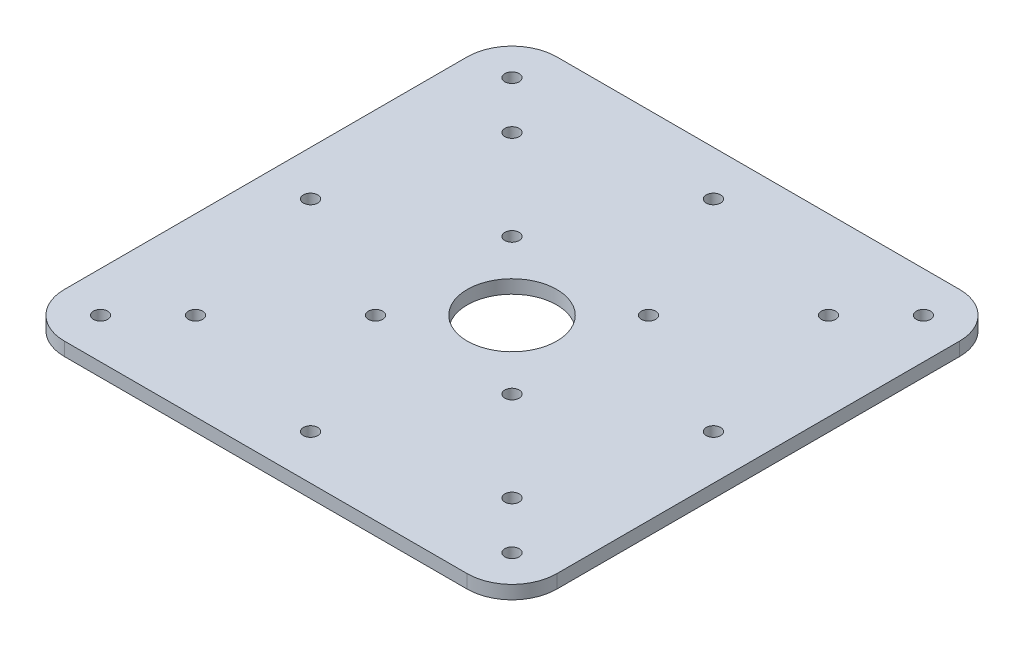
ISO-10303-21;
HEADER;
FILE_DESCRIPTION(('STEP AP214'),'2;1');
FILE_NAME('part.step','',(''),(''),'','','');
FILE_SCHEMA(('AUTOMOTIVE_DESIGN { 1 0 10303 214 1 1 1 1 }'));
ENDSEC;
DATA;
#1=APPLICATION_CONTEXT('core data for automotive mechanical design processes');
#2=APPLICATION_PROTOCOL_DEFINITION('international standard','automotive_design',2000,#1);
#3=PRODUCT_CONTEXT('',#1,'mechanical');
#4=PRODUCT('Part','Part','',(#3));
#5=PRODUCT_RELATED_PRODUCT_CATEGORY('part','',(#4));
#6=PRODUCT_DEFINITION_FORMATION('','',#4);
#7=PRODUCT_DEFINITION_CONTEXT('part definition',#1,'design');
#8=PRODUCT_DEFINITION('design','',#6,#7);
#9=PRODUCT_DEFINITION_SHAPE('','',#8);
#10=(LENGTH_UNIT() NAMED_UNIT(*) SI_UNIT(.MILLI.,.METRE.));
#11=(NAMED_UNIT(*) PLANE_ANGLE_UNIT() SI_UNIT($,.RADIAN.));
#12=(NAMED_UNIT(*) SI_UNIT($,.STERADIAN.) SOLID_ANGLE_UNIT());
#13=UNCERTAINTY_MEASURE_WITH_UNIT(LENGTH_MEASURE(1.E-05),#10,'distance_accuracy_value','');
#14=(GEOMETRIC_REPRESENTATION_CONTEXT(3) GLOBAL_UNCERTAINTY_ASSIGNED_CONTEXT((#13)) GLOBAL_UNIT_ASSIGNED_CONTEXT((#10,
#11,#12)) REPRESENTATION_CONTEXT('',''));
#15=CARTESIAN_POINT('',(0.,0.,0.));
#16=DIRECTION('',(0.,0.,1.));
#17=DIRECTION('',(1.,0.,0.));
#18=AXIS2_PLACEMENT_3D('',#15,#16,#17);
#19=CARTESIAN_POINT('',(0.,3.,0.));
#20=DIRECTION('',(0.,1.,0.));
#21=DIRECTION('',(0.,0.,1.));
#22=AXIS2_PLACEMENT_3D('',#19,#20,#21);
#23=PLANE('',#22);
#24=CARTESIAN_POINT('',(-45.,3.,0.));
#25=DIRECTION('',(0.,1.,0.));
#26=DIRECTION('',(0.,0.,1.));
#27=AXIS2_PLACEMENT_3D('',#24,#25,#26);
#28=CIRCLE('',#27,1.6);
#29=CARTESIAN_POINT('',(-45.,3.,1.6));
#30=VERTEX_POINT('',#29);
#31=EDGE_CURVE('E268',#30,#30,#28,.T.);
#32=ORIENTED_EDGE('',*,*,#31,.F.);
#33=EDGE_LOOP('',(#32));
#34=FACE_BOUND('',#33,.T.);
#35=CARTESIAN_POINT('',(0.,3.,45.));
#36=DIRECTION('',(0.,1.,0.));
#37=DIRECTION('',(0.,0.,1.));
#38=AXIS2_PLACEMENT_3D('',#35,#36,#37);
#39=CIRCLE('',#38,1.6);
#40=CARTESIAN_POINT('',(0.,3.,46.6));
#41=VERTEX_POINT('',#40);
#42=EDGE_CURVE('E258',#41,#41,#39,.T.);
#43=ORIENTED_EDGE('',*,*,#42,.F.);
#44=EDGE_LOOP('',(#43));
#45=FACE_BOUND('',#44,.T.);
#46=CARTESIAN_POINT('',(-35.3553,3.,35.3553));
#47=DIRECTION('',(0.,1.,0.));
#48=DIRECTION('',(0.,0.,1.));
#49=AXIS2_PLACEMENT_3D('',#46,#47,#48);
#50=CIRCLE('',#49,1.6);
#51=CARTESIAN_POINT('',(-35.3553,3.,36.9553));
#52=VERTEX_POINT('',#51);
#53=EDGE_CURVE('E243',#52,#52,#50,.T.);
#54=ORIENTED_EDGE('',*,*,#53,.F.);
#55=EDGE_LOOP('',(#54));
#56=FACE_BOUND('',#55,.T.);
#57=CARTESIAN_POINT('',(35.3553,3.,35.3553));
#58=DIRECTION('',(0.,1.,0.));
#59=DIRECTION('',(0.,0.,-1.));
#60=AXIS2_PLACEMENT_3D('',#57,#58,#59);
#61=CIRCLE('',#60,1.6);
#62=CARTESIAN_POINT('',(35.3553,3.,33.7553));
#63=VERTEX_POINT('',#62);
#64=EDGE_CURVE('E235',#63,#63,#61,.T.);
#65=ORIENTED_EDGE('',*,*,#64,.F.);
#66=EDGE_LOOP('',(#65));
#67=FACE_BOUND('',#66,.T.);
#68=CARTESIAN_POINT('',(-45.9619,3.,-45.9619));
#69=DIRECTION('',(0.,1.,0.));
#70=DIRECTION('',(0.,0.,-1.));
#71=AXIS2_PLACEMENT_3D('',#68,#69,#70);
#72=CIRCLE('',#71,1.6);
#73=CARTESIAN_POINT('',(-45.9619,3.,-47.5619));
#74=VERTEX_POINT('',#73);
#75=EDGE_CURVE('E219',#74,#74,#72,.T.);
#76=ORIENTED_EDGE('',*,*,#75,.F.);
#77=EDGE_LOOP('',(#76));
#78=FACE_BOUND('',#77,.T.);
#79=CARTESIAN_POINT('',(45.9619,3.,-45.9619));
#80=DIRECTION('',(0.,1.,0.));
#81=DIRECTION('',(0.,0.,1.));
#82=AXIS2_PLACEMENT_3D('',#79,#80,#81);
#83=CIRCLE('',#82,1.6);
#84=CARTESIAN_POINT('',(45.9619,3.,-44.3619));
#85=VERTEX_POINT('',#84);
#86=EDGE_CURVE('E208',#85,#85,#83,.T.);
#87=ORIENTED_EDGE('',*,*,#86,.F.);
#88=EDGE_LOOP('',(#87));
#89=FACE_BOUND('',#88,.T.);
#90=CARTESIAN_POINT('',(15.25,3.,15.25));
#91=DIRECTION('',(0.,1.,0.));
#92=DIRECTION('',(0.,0.,-1.));
#93=AXIS2_PLACEMENT_3D('',#90,#91,#92);
#94=CIRCLE('',#93,1.6);
#95=CARTESIAN_POINT('',(15.25,3.,13.65));
#96=VERTEX_POINT('',#95);
#97=EDGE_CURVE('E198',#96,#96,#94,.T.);
#98=ORIENTED_EDGE('',*,*,#97,.F.);
#99=EDGE_LOOP('',(#98));
#100=FACE_BOUND('',#99,.T.);
#101=CARTESIAN_POINT('',(-15.25,3.,-15.25));
#102=DIRECTION('',(0.,1.,0.));
#103=DIRECTION('',(0.,0.,-1.));
#104=AXIS2_PLACEMENT_3D('',#101,#102,#103);
#105=CIRCLE('',#104,1.6);
#106=CARTESIAN_POINT('',(-15.25,3.,-16.85));
#107=VERTEX_POINT('',#106);
#108=EDGE_CURVE('E183',#107,#107,#105,.T.);
#109=ORIENTED_EDGE('',*,*,#108,.F.);
#110=EDGE_LOOP('',(#109));
#111=FACE_BOUND('',#110,.T.);
#112=DIRECTION('',(1.,0.,0.));
#113=VECTOR('',#112,1.);
#114=CARTESIAN_POINT('',(-55.,3.,55.));
#115=LINE('',#114,#113);
#116=CARTESIAN_POINT('',(-45.,3.,55.));
#117=VERTEX_POINT('',#116);
#118=CARTESIAN_POINT('',(45.,3.,55.));
#119=VERTEX_POINT('',#118);
#120=EDGE_CURVE('E143',#117,#119,#115,.T.);
#121=ORIENTED_EDGE('',*,*,#120,.T.);
#122=CARTESIAN_POINT('',(45.,3.,45.));
#123=DIRECTION('',(0.,1.,0.));
#124=DIRECTION('',(0.,0.,1.));
#125=AXIS2_PLACEMENT_3D('',#122,#123,#124);
#126=CIRCLE('',#125,10.);
#127=CARTESIAN_POINT('',(55.,3.,45.));
#128=VERTEX_POINT('',#127);
#129=EDGE_CURVE('E159',#119,#128,#126,.T.);
#130=ORIENTED_EDGE('',*,*,#129,.T.);
#131=DIRECTION('',(0.,0.,-1.));
#132=VECTOR('',#131,1.);
#133=CARTESIAN_POINT('',(55.,3.,-55.));
#134=LINE('',#133,#132);
#135=CARTESIAN_POINT('',(55.,3.,-45.));
#136=VERTEX_POINT('',#135);
#137=EDGE_CURVE('E123',#128,#136,#134,.T.);
#138=ORIENTED_EDGE('',*,*,#137,.T.);
#139=CARTESIAN_POINT('',(45.,3.,-45.));
#140=DIRECTION('',(0.,1.,0.));
#141=DIRECTION('',(0.,0.,1.));
#142=AXIS2_PLACEMENT_3D('',#139,#140,#141);
#143=CIRCLE('',#142,10.);
#144=CARTESIAN_POINT('',(45.,3.,-55.));
#145=VERTEX_POINT('',#144);
#146=EDGE_CURVE('E158',#136,#145,#143,.T.);
#147=ORIENTED_EDGE('',*,*,#146,.T.);
#148=DIRECTION('',(-1.,0.,0.));
#149=VECTOR('',#148,1.);
#150=CARTESIAN_POINT('',(-55.,3.,-55.));
#151=LINE('',#150,#149);
#152=CARTESIAN_POINT('',(-45.,3.,-55.));
#153=VERTEX_POINT('',#152);
#154=EDGE_CURVE('E179',#145,#153,#151,.T.);
#155=ORIENTED_EDGE('',*,*,#154,.T.);
#156=CARTESIAN_POINT('',(-45.,3.,-45.));
#157=DIRECTION('',(0.,1.,0.));
#158=DIRECTION('',(0.,0.,1.));
#159=AXIS2_PLACEMENT_3D('',#156,#157,#158);
#160=CIRCLE('',#159,10.);
#161=CARTESIAN_POINT('',(-55.,3.,-45.));
#162=VERTEX_POINT('',#161);
#163=EDGE_CURVE('E56',#153,#162,#160,.T.);
#164=ORIENTED_EDGE('',*,*,#163,.T.);
#165=DIRECTION('',(0.,0.,1.));
#166=VECTOR('',#165,1.);
#167=CARTESIAN_POINT('',(-55.,3.,-55.));
#168=LINE('',#167,#166);
#169=CARTESIAN_POINT('',(-55.,3.,45.));
#170=VERTEX_POINT('',#169);
#171=EDGE_CURVE('E168',#162,#170,#168,.T.);
#172=ORIENTED_EDGE('',*,*,#171,.T.);
#173=CARTESIAN_POINT('',(-45.,3.,45.));
#174=DIRECTION('',(0.,1.,0.));
#175=DIRECTION('',(0.,0.,1.));
#176=AXIS2_PLACEMENT_3D('',#173,#174,#175);
#177=CIRCLE('',#176,10.);
#178=EDGE_CURVE('E156',#170,#117,#177,.T.);
#179=ORIENTED_EDGE('',*,*,#178,.T.);
#180=EDGE_LOOP('',(#121,#130,#138,#147,#155,#164,#172,#179));
#181=FACE_BOUND('',#180,.T.);
#182=CARTESIAN_POINT('',(15.25,3.,-15.25));
#183=DIRECTION('',(0.,1.,0.));
#184=DIRECTION('',(0.,0.,1.));
#185=AXIS2_PLACEMENT_3D('',#182,#183,#184);
#186=CIRCLE('',#185,1.6);
#187=CARTESIAN_POINT('',(15.25,3.,-13.65));
#188=VERTEX_POINT('',#187);
#189=EDGE_CURVE('E131',#188,#188,#186,.T.);
#190=ORIENTED_EDGE('',*,*,#189,.F.);
#191=EDGE_LOOP('',(#190));
#192=FACE_BOUND('',#191,.T.);
#193=CARTESIAN_POINT('',(-15.25,3.,15.25));
#194=DIRECTION('',(0.,1.,0.));
#195=DIRECTION('',(0.,0.,1.));
#196=AXIS2_PLACEMENT_3D('',#193,#194,#195);
#197=CIRCLE('',#196,1.6);
#198=CARTESIAN_POINT('',(-15.25,3.,16.85));
#199=VERTEX_POINT('',#198);
#200=EDGE_CURVE('E187',#199,#199,#197,.T.);
#201=ORIENTED_EDGE('',*,*,#200,.F.);
#202=EDGE_LOOP('',(#201));
#203=FACE_BOUND('',#202,.T.);
#204=CARTESIAN_POINT('',(35.3553,3.,-35.3553));
#205=DIRECTION('',(0.,1.,0.));
#206=DIRECTION('',(0.,0.,1.));
#207=AXIS2_PLACEMENT_3D('',#204,#205,#206);
#208=CIRCLE('',#207,1.6);
#209=CARTESIAN_POINT('',(35.3553,3.,-33.7553));
#210=VERTEX_POINT('',#209);
#211=EDGE_CURVE('E205',#210,#210,#208,.T.);
#212=ORIENTED_EDGE('',*,*,#211,.F.);
#213=EDGE_LOOP('',(#212));
#214=FACE_BOUND('',#213,.T.);
#215=CARTESIAN_POINT('',(-35.3553,3.,-35.3553));
#216=DIRECTION('',(0.,1.,0.));
#217=DIRECTION('',(0.,0.,-1.));
#218=AXIS2_PLACEMENT_3D('',#215,#216,#217);
#219=CIRCLE('',#218,1.6);
#220=CARTESIAN_POINT('',(-35.3553,3.,-36.9553));
#221=VERTEX_POINT('',#220);
#222=EDGE_CURVE('E212',#221,#221,#219,.T.);
#223=ORIENTED_EDGE('',*,*,#222,.F.);
#224=EDGE_LOOP('',(#223));
#225=FACE_BOUND('',#224,.T.);
#226=CARTESIAN_POINT('',(45.9619,3.,45.9619));
#227=DIRECTION('',(0.,1.,0.));
#228=DIRECTION('',(0.,0.,-1.));
#229=AXIS2_PLACEMENT_3D('',#226,#227,#228);
#230=CIRCLE('',#229,1.6);
#231=CARTESIAN_POINT('',(45.9619,3.,44.3619));
#232=VERTEX_POINT('',#231);
#233=EDGE_CURVE('E229',#232,#232,#230,.T.);
#234=ORIENTED_EDGE('',*,*,#233,.F.);
#235=EDGE_LOOP('',(#234));
#236=FACE_BOUND('',#235,.T.);
#237=CARTESIAN_POINT('',(-45.9619,3.,45.9619));
#238=DIRECTION('',(0.,1.,0.));
#239=DIRECTION('',(0.,0.,1.));
#240=AXIS2_PLACEMENT_3D('',#237,#238,#239);
#241=CIRCLE('',#240,1.6);
#242=CARTESIAN_POINT('',(-45.9619,3.,47.5619));
#243=VERTEX_POINT('',#242);
#244=EDGE_CURVE('E236',#243,#243,#241,.T.);
#245=ORIENTED_EDGE('',*,*,#244,.F.);
#246=EDGE_LOOP('',(#245));
#247=FACE_BOUND('',#246,.T.);
#248=CARTESIAN_POINT('',(0.,3.,-45.));
#249=DIRECTION('',(0.,1.,0.));
#250=DIRECTION('',(0.,0.,1.));
#251=AXIS2_PLACEMENT_3D('',#248,#249,#250);
#252=CIRCLE('',#251,1.6);
#253=CARTESIAN_POINT('',(0.,3.,-43.4));
#254=VERTEX_POINT('',#253);
#255=EDGE_CURVE('E249',#254,#254,#252,.T.);
#256=ORIENTED_EDGE('',*,*,#255,.F.);
#257=EDGE_LOOP('',(#256));
#258=FACE_BOUND('',#257,.T.);
#259=CARTESIAN_POINT('',(45.,3.,0.));
#260=DIRECTION('',(0.,1.,0.));
#261=DIRECTION('',(0.,0.,1.));
#262=AXIS2_PLACEMENT_3D('',#259,#260,#261);
#263=CIRCLE('',#262,1.6);
#264=CARTESIAN_POINT('',(45.,3.,1.6));
#265=VERTEX_POINT('',#264);
#266=EDGE_CURVE('E265',#265,#265,#263,.T.);
#267=ORIENTED_EDGE('',*,*,#266,.F.);
#268=EDGE_LOOP('',(#267));
#269=FACE_BOUND('',#268,.T.);
#270=CARTESIAN_POINT('',(0.,3.,0.));
#271=DIRECTION('',(0.,1.,0.));
#272=DIRECTION('',(0.,0.,1.));
#273=AXIS2_PLACEMENT_3D('',#270,#271,#272);
#274=CIRCLE('',#273,10.);
#275=CARTESIAN_POINT('',(0.,3.,10.));
#276=VERTEX_POINT('',#275);
#277=EDGE_CURVE('E273',#276,#276,#274,.T.);
#278=ORIENTED_EDGE('',*,*,#277,.F.);
#279=EDGE_LOOP('',(#278));
#280=FACE_BOUND('',#279,.T.);
#281=ADVANCED_FACE('F39',(#34,#45,#56,#67,#78,#89,#100,#111,#181,#192,#203,#214,#225,#236,#247,
#258,#269,#280),#23,.T.);
#282=CARTESIAN_POINT('',(0.,0.,0.));
#283=DIRECTION('',(0.,1.,0.));
#284=DIRECTION('',(0.,0.,1.));
#285=AXIS2_PLACEMENT_3D('',#282,#283,#284);
#286=PLANE('',#285);
#287=DIRECTION('',(0.,0.,-1.));
#288=VECTOR('',#287,1.);
#289=CARTESIAN_POINT('',(55.,0.,-55.));
#290=LINE('',#289,#288);
#291=CARTESIAN_POINT('',(55.,0.,45.));
#292=VERTEX_POINT('',#291);
#293=CARTESIAN_POINT('',(55.,0.,-45.));
#294=VERTEX_POINT('',#293);
#295=EDGE_CURVE('E121',#292,#294,#290,.T.);
#296=ORIENTED_EDGE('',*,*,#295,.F.);
#297=CARTESIAN_POINT('',(45.,0.,45.));
#298=DIRECTION('',(0.,1.,0.));
#299=DIRECTION('',(0.,0.,1.));
#300=AXIS2_PLACEMENT_3D('',#297,#298,#299);
#301=CIRCLE('',#300,10.);
#302=CARTESIAN_POINT('',(45.,0.,55.));
#303=VERTEX_POINT('',#302);
#304=EDGE_CURVE('E102',#292,#303,#301,.F.);
#305=ORIENTED_EDGE('',*,*,#304,.T.);
#306=DIRECTION('',(1.,0.,0.));
#307=VECTOR('',#306,1.);
#308=CARTESIAN_POINT('',(-55.,0.,55.));
#309=LINE('',#308,#307);
#310=CARTESIAN_POINT('',(-45.,0.,55.));
#311=VERTEX_POINT('',#310);
#312=EDGE_CURVE('E144',#311,#303,#309,.T.);
#313=ORIENTED_EDGE('',*,*,#312,.F.);
#314=CARTESIAN_POINT('',(-45.,0.,45.));
#315=DIRECTION('',(0.,1.,0.));
#316=DIRECTION('',(0.,0.,1.));
#317=AXIS2_PLACEMENT_3D('',#314,#315,#316);
#318=CIRCLE('',#317,10.);
#319=CARTESIAN_POINT('',(-55.,0.,45.));
#320=VERTEX_POINT('',#319);
#321=EDGE_CURVE('E149',#311,#320,#318,.F.);
#322=ORIENTED_EDGE('',*,*,#321,.T.);
#323=DIRECTION('',(0.,0.,1.));
#324=VECTOR('',#323,1.);
#325=CARTESIAN_POINT('',(-55.,0.,-55.));
#326=LINE('',#325,#324);
#327=CARTESIAN_POINT('',(-55.,0.,-45.));
#328=VERTEX_POINT('',#327);
#329=EDGE_CURVE('E132',#328,#320,#326,.T.);
#330=ORIENTED_EDGE('',*,*,#329,.F.);
#331=CARTESIAN_POINT('',(-45.,0.,-45.));
#332=DIRECTION('',(0.,1.,0.));
#333=DIRECTION('',(0.,0.,1.));
#334=AXIS2_PLACEMENT_3D('',#331,#332,#333);
#335=CIRCLE('',#334,10.);
#336=CARTESIAN_POINT('',(-45.,0.,-55.));
#337=VERTEX_POINT('',#336);
#338=EDGE_CURVE('E124',#328,#337,#335,.F.);
#339=ORIENTED_EDGE('',*,*,#338,.T.);
#340=DIRECTION('',(-1.,0.,0.));
#341=VECTOR('',#340,1.);
#342=CARTESIAN_POINT('',(-55.,0.,-55.));
#343=LINE('',#342,#341);
#344=CARTESIAN_POINT('',(45.,0.,-55.));
#345=VERTEX_POINT('',#344);
#346=EDGE_CURVE('E134',#345,#337,#343,.T.);
#347=ORIENTED_EDGE('',*,*,#346,.F.);
#348=CARTESIAN_POINT('',(45.,0.,-45.));
#349=DIRECTION('',(0.,1.,0.));
#350=DIRECTION('',(0.,0.,1.));
#351=AXIS2_PLACEMENT_3D('',#348,#349,#350);
#352=CIRCLE('',#351,10.);
#353=EDGE_CURVE('E113',#345,#294,#352,.F.);
#354=ORIENTED_EDGE('',*,*,#353,.T.);
#355=EDGE_LOOP('',(#296,#305,#313,#322,#330,#339,#347,#354));
#356=FACE_BOUND('',#355,.T.);
#357=CARTESIAN_POINT('',(15.25,0.,-15.25));
#358=DIRECTION('',(0.,1.,0.));
#359=DIRECTION('',(0.,0.,1.));
#360=AXIS2_PLACEMENT_3D('',#357,#358,#359);
#361=CIRCLE('',#360,1.6);
#362=CARTESIAN_POINT('',(15.25,0.,-13.65));
#363=VERTEX_POINT('',#362);
#364=EDGE_CURVE('E137',#363,#363,#361,.T.);
#365=ORIENTED_EDGE('',*,*,#364,.T.);
#366=EDGE_LOOP('',(#365));
#367=FACE_BOUND('',#366,.T.);
#368=CARTESIAN_POINT('',(-15.25,0.,-15.25));
#369=DIRECTION('',(0.,1.,0.));
#370=DIRECTION('',(0.,0.,-1.));
#371=AXIS2_PLACEMENT_3D('',#368,#369,#370);
#372=CIRCLE('',#371,1.6);
#373=CARTESIAN_POINT('',(-15.25,0.,-16.85));
#374=VERTEX_POINT('',#373);
#375=EDGE_CURVE('E186',#374,#374,#372,.T.);
#376=ORIENTED_EDGE('',*,*,#375,.T.);
#377=EDGE_LOOP('',(#376));
#378=FACE_BOUND('',#377,.T.);
#379=CARTESIAN_POINT('',(-15.25,0.,15.25));
#380=DIRECTION('',(0.,1.,0.));
#381=DIRECTION('',(0.,0.,1.));
#382=AXIS2_PLACEMENT_3D('',#379,#380,#381);
#383=CIRCLE('',#382,1.6);
#384=CARTESIAN_POINT('',(-15.25,0.,16.85));
#385=VERTEX_POINT('',#384);
#386=EDGE_CURVE('E192',#385,#385,#383,.T.);
#387=ORIENTED_EDGE('',*,*,#386,.T.);
#388=EDGE_LOOP('',(#387));
#389=FACE_BOUND('',#388,.T.);
#390=CARTESIAN_POINT('',(15.25,0.,15.25));
#391=DIRECTION('',(0.,1.,0.));
#392=DIRECTION('',(0.,0.,-1.));
#393=AXIS2_PLACEMENT_3D('',#390,#391,#392);
#394=CIRCLE('',#393,1.6);
#395=CARTESIAN_POINT('',(15.25,0.,13.65));
#396=VERTEX_POINT('',#395);
#397=EDGE_CURVE('E200',#396,#396,#394,.T.);
#398=ORIENTED_EDGE('',*,*,#397,.T.);
#399=EDGE_LOOP('',(#398));
#400=FACE_BOUND('',#399,.T.);
#401=CARTESIAN_POINT('',(35.3553,0.,-35.3553));
#402=DIRECTION('',(0.,1.,0.));
#403=DIRECTION('',(0.,0.,1.));
#404=AXIS2_PLACEMENT_3D('',#401,#402,#403);
#405=CIRCLE('',#404,1.6);
#406=CARTESIAN_POINT('',(35.3553,0.,-33.7553));
#407=VERTEX_POINT('',#406);
#408=EDGE_CURVE('E202',#407,#407,#405,.T.);
#409=ORIENTED_EDGE('',*,*,#408,.T.);
#410=EDGE_LOOP('',(#409));
#411=FACE_BOUND('',#410,.T.);
#412=CARTESIAN_POINT('',(45.9619,0.,-45.9619));
#413=DIRECTION('',(0.,1.,0.));
#414=DIRECTION('',(0.,0.,1.));
#415=AXIS2_PLACEMENT_3D('',#412,#413,#414);
#416=CIRCLE('',#415,1.6);
#417=CARTESIAN_POINT('',(45.9619,0.,-44.3619));
#418=VERTEX_POINT('',#417);
#419=EDGE_CURVE('E211',#418,#418,#416,.T.);
#420=ORIENTED_EDGE('',*,*,#419,.T.);
#421=EDGE_LOOP('',(#420));
#422=FACE_BOUND('',#421,.T.);
#423=CARTESIAN_POINT('',(-35.3553,0.,-35.3553));
#424=DIRECTION('',(0.,1.,0.));
#425=DIRECTION('',(0.,0.,-1.));
#426=AXIS2_PLACEMENT_3D('',#423,#424,#425);
#427=CIRCLE('',#426,1.6);
#428=CARTESIAN_POINT('',(-35.3553,0.,-36.9553));
#429=VERTEX_POINT('',#428);
#430=EDGE_CURVE('E220',#429,#429,#427,.T.);
#431=ORIENTED_EDGE('',*,*,#430,.T.);
#432=EDGE_LOOP('',(#431));
#433=FACE_BOUND('',#432,.T.);
#434=CARTESIAN_POINT('',(-45.9619,0.,-45.9619));
#435=DIRECTION('',(0.,1.,0.));
#436=DIRECTION('',(0.,0.,-1.));
#437=AXIS2_PLACEMENT_3D('',#434,#435,#436);
#438=CIRCLE('',#437,1.6);
#439=CARTESIAN_POINT('',(-45.9619,0.,-47.5619));
#440=VERTEX_POINT('',#439);
#441=EDGE_CURVE('E224',#440,#440,#438,.T.);
#442=ORIENTED_EDGE('',*,*,#441,.T.);
#443=EDGE_LOOP('',(#442));
#444=FACE_BOUND('',#443,.T.);
#445=CARTESIAN_POINT('',(45.9619,0.,45.9619));
#446=DIRECTION('',(0.,1.,0.));
#447=DIRECTION('',(0.,0.,-1.));
#448=AXIS2_PLACEMENT_3D('',#445,#446,#447);
#449=CIRCLE('',#448,1.6);
#450=CARTESIAN_POINT('',(45.9619,0.,44.3619));
#451=VERTEX_POINT('',#450);
#452=EDGE_CURVE('E228',#451,#451,#449,.T.);
#453=ORIENTED_EDGE('',*,*,#452,.T.);
#454=EDGE_LOOP('',(#453));
#455=FACE_BOUND('',#454,.T.);
#456=CARTESIAN_POINT('',(35.3553,0.,35.3553));
#457=DIRECTION('',(0.,1.,0.));
#458=DIRECTION('',(0.,0.,-1.));
#459=AXIS2_PLACEMENT_3D('',#456,#457,#458);
#460=CIRCLE('',#459,1.6);
#461=CARTESIAN_POINT('',(35.3553,0.,33.7553));
#462=VERTEX_POINT('',#461);
#463=EDGE_CURVE('E234',#462,#462,#460,.T.);
#464=ORIENTED_EDGE('',*,*,#463,.T.);
#465=EDGE_LOOP('',(#464));
#466=FACE_BOUND('',#465,.T.);
#467=CARTESIAN_POINT('',(-45.9619,0.,45.9619));
#468=DIRECTION('',(0.,1.,0.));
#469=DIRECTION('',(0.,0.,1.));
#470=AXIS2_PLACEMENT_3D('',#467,#468,#469);
#471=CIRCLE('',#470,1.6);
#472=CARTESIAN_POINT('',(-45.9619,0.,47.5619));
#473=VERTEX_POINT('',#472);
#474=EDGE_CURVE('E244',#473,#473,#471,.T.);
#475=ORIENTED_EDGE('',*,*,#474,.T.);
#476=EDGE_LOOP('',(#475));
#477=FACE_BOUND('',#476,.T.);
#478=CARTESIAN_POINT('',(-35.3553,0.,35.3553));
#479=DIRECTION('',(0.,1.,0.));
#480=DIRECTION('',(0.,0.,1.));
#481=AXIS2_PLACEMENT_3D('',#478,#479,#480);
#482=CIRCLE('',#481,1.6);
#483=CARTESIAN_POINT('',(-35.3553,0.,36.9553));
#484=VERTEX_POINT('',#483);
#485=EDGE_CURVE('E250',#484,#484,#482,.T.);
#486=ORIENTED_EDGE('',*,*,#485,.T.);
#487=EDGE_LOOP('',(#486));
#488=FACE_BOUND('',#487,.T.);
#489=CARTESIAN_POINT('',(0.,0.,-45.));
#490=DIRECTION('',(0.,1.,0.));
#491=DIRECTION('',(0.,0.,1.));
#492=AXIS2_PLACEMENT_3D('',#489,#490,#491);
#493=CIRCLE('',#492,1.6);
#494=CARTESIAN_POINT('',(0.,0.,-43.4));
#495=VERTEX_POINT('',#494);
#496=EDGE_CURVE('E251',#495,#495,#493,.T.);
#497=ORIENTED_EDGE('',*,*,#496,.T.);
#498=EDGE_LOOP('',(#497));
#499=FACE_BOUND('',#498,.T.);
#500=CARTESIAN_POINT('',(0.,0.,45.));
#501=DIRECTION('',(0.,1.,0.));
#502=DIRECTION('',(0.,0.,1.));
#503=AXIS2_PLACEMENT_3D('',#500,#501,#502);
#504=CIRCLE('',#503,1.6);
#505=CARTESIAN_POINT('',(0.,0.,46.6));
#506=VERTEX_POINT('',#505);
#507=EDGE_CURVE('E259',#506,#506,#504,.T.);
#508=ORIENTED_EDGE('',*,*,#507,.T.);
#509=EDGE_LOOP('',(#508));
#510=FACE_BOUND('',#509,.T.);
#511=CARTESIAN_POINT('',(45.,0.,0.));
#512=DIRECTION('',(0.,1.,0.));
#513=DIRECTION('',(0.,0.,1.));
#514=AXIS2_PLACEMENT_3D('',#511,#512,#513);
#515=CIRCLE('',#514,1.6);
#516=CARTESIAN_POINT('',(45.,0.,1.6));
#517=VERTEX_POINT('',#516);
#518=EDGE_CURVE('E264',#517,#517,#515,.T.);
#519=ORIENTED_EDGE('',*,*,#518,.T.);
#520=EDGE_LOOP('',(#519));
#521=FACE_BOUND('',#520,.T.);
#522=CARTESIAN_POINT('',(-45.,0.,0.));
#523=DIRECTION('',(0.,1.,0.));
#524=DIRECTION('',(0.,0.,1.));
#525=AXIS2_PLACEMENT_3D('',#522,#523,#524);
#526=CIRCLE('',#525,1.6);
#527=CARTESIAN_POINT('',(-45.,0.,1.6));
#528=VERTEX_POINT('',#527);
#529=EDGE_CURVE('E271',#528,#528,#526,.T.);
#530=ORIENTED_EDGE('',*,*,#529,.T.);
#531=EDGE_LOOP('',(#530));
#532=FACE_BOUND('',#531,.T.);
#533=CARTESIAN_POINT('',(0.,0.,0.));
#534=DIRECTION('',(0.,1.,0.));
#535=DIRECTION('',(0.,0.,1.));
#536=AXIS2_PLACEMENT_3D('',#533,#534,#535);
#537=CIRCLE('',#536,10.);
#538=CARTESIAN_POINT('',(0.,0.,10.));
#539=VERTEX_POINT('',#538);
#540=EDGE_CURVE('E280',#539,#539,#537,.T.);
#541=ORIENTED_EDGE('',*,*,#540,.T.);
#542=EDGE_LOOP('',(#541));
#543=FACE_BOUND('',#542,.T.);
#544=ADVANCED_FACE('F126',(#356,#367,#378,#389,#400,#411,#422,#433,#444,#455,#466,#477,#488,
#499,#510,#521,#532,#543),#286,.F.);
#545=CARTESIAN_POINT('',(55.,3.,-55.));
#546=DIRECTION('',(-1.,0.,0.));
#547=DIRECTION('',(0.,0.,1.));
#548=AXIS2_PLACEMENT_3D('',#545,#546,#547);
#549=PLANE('',#548);
#550=ORIENTED_EDGE('',*,*,#137,.F.);
#551=DIRECTION('',(0.,-1.,0.));
#552=VECTOR('',#551,1.);
#553=CARTESIAN_POINT('',(55.,3.,45.));
#554=LINE('',#553,#552);
#555=EDGE_CURVE('E107',#128,#292,#554,.T.);
#556=ORIENTED_EDGE('',*,*,#555,.T.);
#557=ORIENTED_EDGE('',*,*,#295,.T.);
#558=DIRECTION('',(0.,-1.,0.));
#559=VECTOR('',#558,1.);
#560=CARTESIAN_POINT('',(55.,3.,-45.));
#561=LINE('',#560,#559);
#562=EDGE_CURVE('E127',#294,#136,#561,.F.);
#563=ORIENTED_EDGE('',*,*,#562,.T.);
#564=EDGE_LOOP('',(#550,#556,#557,#563));
#565=FACE_BOUND('',#564,.T.);
#566=ADVANCED_FACE('F117',(#565),#549,.F.);
#567=CARTESIAN_POINT('',(-55.,3.,-55.));
#568=DIRECTION('',(0.,0.,1.));
#569=DIRECTION('',(1.,0.,0.));
#570=AXIS2_PLACEMENT_3D('',#567,#568,#569);
#571=PLANE('',#570);
#572=ORIENTED_EDGE('',*,*,#154,.F.);
#573=DIRECTION('',(0.,-1.,0.));
#574=VECTOR('',#573,1.);
#575=CARTESIAN_POINT('',(45.,3.,-55.));
#576=LINE('',#575,#574);
#577=EDGE_CURVE('E163',#145,#345,#576,.T.);
#578=ORIENTED_EDGE('',*,*,#577,.T.);
#579=ORIENTED_EDGE('',*,*,#346,.T.);
#580=DIRECTION('',(0.,-1.,0.));
#581=VECTOR('',#580,1.);
#582=CARTESIAN_POINT('',(-45.,3.,-55.));
#583=LINE('',#582,#581);
#584=EDGE_CURVE('E165',#337,#153,#583,.F.);
#585=ORIENTED_EDGE('',*,*,#584,.T.);
#586=EDGE_LOOP('',(#572,#578,#579,#585));
#587=FACE_BOUND('',#586,.T.);
#588=ADVANCED_FACE('F303',(#587),#571,.F.);
#589=CARTESIAN_POINT('',(-55.,3.,-55.));
#590=DIRECTION('',(1.,0.,0.));
#591=DIRECTION('',(0.,0.,-1.));
#592=AXIS2_PLACEMENT_3D('',#589,#590,#591);
#593=PLANE('',#592);
#594=ORIENTED_EDGE('',*,*,#329,.T.);
#595=DIRECTION('',(0.,-1.,0.));
#596=VECTOR('',#595,1.);
#597=CARTESIAN_POINT('',(-55.,3.,45.));
#598=LINE('',#597,#596);
#599=EDGE_CURVE('E11',#320,#170,#598,.F.);
#600=ORIENTED_EDGE('',*,*,#599,.T.);
#601=ORIENTED_EDGE('',*,*,#171,.F.);
#602=DIRECTION('',(0.,-1.,0.));
#603=VECTOR('',#602,1.);
#604=CARTESIAN_POINT('',(-55.,3.,-45.));
#605=LINE('',#604,#603);
#606=EDGE_CURVE('E50',#162,#328,#605,.T.);
#607=ORIENTED_EDGE('',*,*,#606,.T.);
#608=EDGE_LOOP('',(#594,#600,#601,#607));
#609=FACE_BOUND('',#608,.T.);
#610=ADVANCED_FACE('F166',(#609),#593,.F.);
#611=CARTESIAN_POINT('',(-55.,3.,55.));
#612=DIRECTION('',(0.,0.,-1.));
#613=DIRECTION('',(-1.,0.,0.));
#614=AXIS2_PLACEMENT_3D('',#611,#612,#613);
#615=PLANE('',#614);
#616=ORIENTED_EDGE('',*,*,#312,.T.);
#617=DIRECTION('',(0.,-1.,0.));
#618=VECTOR('',#617,1.);
#619=CARTESIAN_POINT('',(45.,3.,55.));
#620=LINE('',#619,#618);
#621=EDGE_CURVE('E108',#303,#119,#620,.F.);
#622=ORIENTED_EDGE('',*,*,#621,.T.);
#623=ORIENTED_EDGE('',*,*,#120,.F.);
#624=DIRECTION('',(0.,-1.,0.));
#625=VECTOR('',#624,1.);
#626=CARTESIAN_POINT('',(-45.,3.,55.));
#627=LINE('',#626,#625);
#628=EDGE_CURVE('E111',#117,#311,#627,.T.);
#629=ORIENTED_EDGE('',*,*,#628,.T.);
#630=EDGE_LOOP('',(#616,#622,#623,#629));
#631=FACE_BOUND('',#630,.T.);
#632=ADVANCED_FACE('F177',(#631),#615,.F.);
#633=CARTESIAN_POINT('',(15.25,3.,-15.25));
#634=DIRECTION('',(0.,-1.,0.));
#635=DIRECTION('',(0.,0.,-1.));
#636=AXIS2_PLACEMENT_3D('',#633,#634,#635);
#637=CYLINDRICAL_SURFACE('',#636,1.6);
#638=ORIENTED_EDGE('',*,*,#189,.T.);
#639=EDGE_LOOP('',(#638));
#640=FACE_BOUND('',#639,.T.);
#641=ORIENTED_EDGE('',*,*,#364,.F.);
#642=EDGE_LOOP('',(#641));
#643=FACE_BOUND('',#642,.T.);
#644=ADVANCED_FACE('F296',(#640,#643),#637,.F.);
#645=CARTESIAN_POINT('',(-15.25,3.,-15.25));
#646=DIRECTION('',(0.,-1.,0.));
#647=DIRECTION('',(0.,0.,-1.));
#648=AXIS2_PLACEMENT_3D('',#645,#646,#647);
#649=CYLINDRICAL_SURFACE('',#648,1.6);
#650=ORIENTED_EDGE('',*,*,#108,.T.);
#651=EDGE_LOOP('',(#650));
#652=FACE_BOUND('',#651,.T.);
#653=ORIENTED_EDGE('',*,*,#375,.F.);
#654=EDGE_LOOP('',(#653));
#655=FACE_BOUND('',#654,.T.);
#656=ADVANCED_FACE('F409',(#652,#655),#649,.F.);
#657=CARTESIAN_POINT('',(-15.25,3.,15.25));
#658=DIRECTION('',(0.,-1.,0.));
#659=DIRECTION('',(0.,0.,-1.));
#660=AXIS2_PLACEMENT_3D('',#657,#658,#659);
#661=CYLINDRICAL_SURFACE('',#660,1.6);
#662=ORIENTED_EDGE('',*,*,#200,.T.);
#663=EDGE_LOOP('',(#662));
#664=FACE_BOUND('',#663,.T.);
#665=ORIENTED_EDGE('',*,*,#386,.F.);
#666=EDGE_LOOP('',(#665));
#667=FACE_BOUND('',#666,.T.);
#668=ADVANCED_FACE('F401',(#664,#667),#661,.F.);
#669=CARTESIAN_POINT('',(15.25,3.,15.25));
#670=DIRECTION('',(0.,-1.,0.));
#671=DIRECTION('',(0.,0.,-1.));
#672=AXIS2_PLACEMENT_3D('',#669,#670,#671);
#673=CYLINDRICAL_SURFACE('',#672,1.6);
#674=ORIENTED_EDGE('',*,*,#97,.T.);
#675=EDGE_LOOP('',(#674));
#676=FACE_BOUND('',#675,.T.);
#677=ORIENTED_EDGE('',*,*,#397,.F.);
#678=EDGE_LOOP('',(#677));
#679=FACE_BOUND('',#678,.T.);
#680=ADVANCED_FACE('F398',(#676,#679),#673,.F.);
#681=CARTESIAN_POINT('',(35.3553,3.,-35.3553));
#682=DIRECTION('',(0.,-1.,0.));
#683=DIRECTION('',(0.,0.,-1.));
#684=AXIS2_PLACEMENT_3D('',#681,#682,#683);
#685=CYLINDRICAL_SURFACE('',#684,1.6);
#686=ORIENTED_EDGE('',*,*,#211,.T.);
#687=EDGE_LOOP('',(#686));
#688=FACE_BOUND('',#687,.T.);
#689=ORIENTED_EDGE('',*,*,#408,.F.);
#690=EDGE_LOOP('',(#689));
#691=FACE_BOUND('',#690,.T.);
#692=ADVANCED_FACE('F392',(#688,#691),#685,.F.);
#693=CARTESIAN_POINT('',(45.9619,3.,-45.9619));
#694=DIRECTION('',(0.,-1.,0.));
#695=DIRECTION('',(0.,0.,-1.));
#696=AXIS2_PLACEMENT_3D('',#693,#694,#695);
#697=CYLINDRICAL_SURFACE('',#696,1.6);
#698=ORIENTED_EDGE('',*,*,#86,.T.);
#699=EDGE_LOOP('',(#698));
#700=FACE_BOUND('',#699,.T.);
#701=ORIENTED_EDGE('',*,*,#419,.F.);
#702=EDGE_LOOP('',(#701));
#703=FACE_BOUND('',#702,.T.);
#704=ADVANCED_FACE('F394',(#700,#703),#697,.F.);
#705=CARTESIAN_POINT('',(-35.3553,3.,-35.3553));
#706=DIRECTION('',(0.,-1.,0.));
#707=DIRECTION('',(0.,0.,-1.));
#708=AXIS2_PLACEMENT_3D('',#705,#706,#707);
#709=CYLINDRICAL_SURFACE('',#708,1.6);
#710=ORIENTED_EDGE('',*,*,#222,.T.);
#711=EDGE_LOOP('',(#710));
#712=FACE_BOUND('',#711,.T.);
#713=ORIENTED_EDGE('',*,*,#430,.F.);
#714=EDGE_LOOP('',(#713));
#715=FACE_BOUND('',#714,.T.);
#716=ADVANCED_FACE('F390',(#712,#715),#709,.F.);
#717=CARTESIAN_POINT('',(-45.9619,3.,-45.9619));
#718=DIRECTION('',(0.,-1.,0.));
#719=DIRECTION('',(0.,0.,-1.));
#720=AXIS2_PLACEMENT_3D('',#717,#718,#719);
#721=CYLINDRICAL_SURFACE('',#720,1.6);
#722=ORIENTED_EDGE('',*,*,#75,.T.);
#723=EDGE_LOOP('',(#722));
#724=FACE_BOUND('',#723,.T.);
#725=ORIENTED_EDGE('',*,*,#441,.F.);
#726=EDGE_LOOP('',(#725));
#727=FACE_BOUND('',#726,.T.);
#728=ADVANCED_FACE('F382',(#724,#727),#721,.F.);
#729=CARTESIAN_POINT('',(45.9619,3.,45.9619));
#730=DIRECTION('',(0.,-1.,0.));
#731=DIRECTION('',(0.,0.,-1.));
#732=AXIS2_PLACEMENT_3D('',#729,#730,#731);
#733=CYLINDRICAL_SURFACE('',#732,1.6);
#734=ORIENTED_EDGE('',*,*,#233,.T.);
#735=EDGE_LOOP('',(#734));
#736=FACE_BOUND('',#735,.T.);
#737=ORIENTED_EDGE('',*,*,#452,.F.);
#738=EDGE_LOOP('',(#737));
#739=FACE_BOUND('',#738,.T.);
#740=ADVANCED_FACE('F377',(#736,#739),#733,.F.);
#741=CARTESIAN_POINT('',(35.3553,3.,35.3553));
#742=DIRECTION('',(0.,-1.,0.));
#743=DIRECTION('',(0.,0.,-1.));
#744=AXIS2_PLACEMENT_3D('',#741,#742,#743);
#745=CYLINDRICAL_SURFACE('',#744,1.6);
#746=ORIENTED_EDGE('',*,*,#64,.T.);
#747=EDGE_LOOP('',(#746));
#748=FACE_BOUND('',#747,.T.);
#749=ORIENTED_EDGE('',*,*,#463,.F.);
#750=EDGE_LOOP('',(#749));
#751=FACE_BOUND('',#750,.T.);
#752=ADVANCED_FACE('F374',(#748,#751),#745,.F.);
#753=CARTESIAN_POINT('',(-45.9619,3.,45.9619));
#754=DIRECTION('',(0.,-1.,0.));
#755=DIRECTION('',(0.,0.,-1.));
#756=AXIS2_PLACEMENT_3D('',#753,#754,#755);
#757=CYLINDRICAL_SURFACE('',#756,1.6);
#758=ORIENTED_EDGE('',*,*,#244,.T.);
#759=EDGE_LOOP('',(#758));
#760=FACE_BOUND('',#759,.T.);
#761=ORIENTED_EDGE('',*,*,#474,.F.);
#762=EDGE_LOOP('',(#761));
#763=FACE_BOUND('',#762,.T.);
#764=ADVANCED_FACE('F371',(#760,#763),#757,.F.);
#765=CARTESIAN_POINT('',(-35.3553,3.,35.3553));
#766=DIRECTION('',(0.,-1.,0.));
#767=DIRECTION('',(0.,0.,-1.));
#768=AXIS2_PLACEMENT_3D('',#765,#766,#767);
#769=CYLINDRICAL_SURFACE('',#768,1.6);
#770=ORIENTED_EDGE('',*,*,#53,.T.);
#771=EDGE_LOOP('',(#770));
#772=FACE_BOUND('',#771,.T.);
#773=ORIENTED_EDGE('',*,*,#485,.F.);
#774=EDGE_LOOP('',(#773));
#775=FACE_BOUND('',#774,.T.);
#776=ADVANCED_FACE('F370',(#772,#775),#769,.F.);
#777=CARTESIAN_POINT('',(0.,3.,-45.));
#778=DIRECTION('',(0.,-1.,0.));
#779=DIRECTION('',(0.,0.,-1.));
#780=AXIS2_PLACEMENT_3D('',#777,#778,#779);
#781=CYLINDRICAL_SURFACE('',#780,1.6);
#782=ORIENTED_EDGE('',*,*,#255,.T.);
#783=EDGE_LOOP('',(#782));
#784=FACE_BOUND('',#783,.T.);
#785=ORIENTED_EDGE('',*,*,#496,.F.);
#786=EDGE_LOOP('',(#785));
#787=FACE_BOUND('',#786,.T.);
#788=ADVANCED_FACE('F361',(#784,#787),#781,.F.);
#789=CARTESIAN_POINT('',(0.,3.,45.));
#790=DIRECTION('',(0.,-1.,0.));
#791=DIRECTION('',(0.,0.,-1.));
#792=AXIS2_PLACEMENT_3D('',#789,#790,#791);
#793=CYLINDRICAL_SURFACE('',#792,1.6);
#794=ORIENTED_EDGE('',*,*,#42,.T.);
#795=EDGE_LOOP('',(#794));
#796=FACE_BOUND('',#795,.T.);
#797=ORIENTED_EDGE('',*,*,#507,.F.);
#798=EDGE_LOOP('',(#797));
#799=FACE_BOUND('',#798,.T.);
#800=ADVANCED_FACE('F347',(#796,#799),#793,.F.);
#801=CARTESIAN_POINT('',(45.,3.,0.));
#802=DIRECTION('',(0.,-1.,0.));
#803=DIRECTION('',(0.,0.,-1.));
#804=AXIS2_PLACEMENT_3D('',#801,#802,#803);
#805=CYLINDRICAL_SURFACE('',#804,1.6);
#806=ORIENTED_EDGE('',*,*,#266,.T.);
#807=EDGE_LOOP('',(#806));
#808=FACE_BOUND('',#807,.T.);
#809=ORIENTED_EDGE('',*,*,#518,.F.);
#810=EDGE_LOOP('',(#809));
#811=FACE_BOUND('',#810,.T.);
#812=ADVANCED_FACE('F345',(#808,#811),#805,.F.);
#813=CARTESIAN_POINT('',(-45.,3.,0.));
#814=DIRECTION('',(0.,-1.,0.));
#815=DIRECTION('',(0.,0.,-1.));
#816=AXIS2_PLACEMENT_3D('',#813,#814,#815);
#817=CYLINDRICAL_SURFACE('',#816,1.6);
#818=ORIENTED_EDGE('',*,*,#31,.T.);
#819=EDGE_LOOP('',(#818));
#820=FACE_BOUND('',#819,.T.);
#821=ORIENTED_EDGE('',*,*,#529,.F.);
#822=EDGE_LOOP('',(#821));
#823=FACE_BOUND('',#822,.T.);
#824=ADVANCED_FACE('F344',(#820,#823),#817,.F.);
#825=CARTESIAN_POINT('',(0.,3.,0.));
#826=DIRECTION('',(0.,-1.,0.));
#827=DIRECTION('',(0.,0.,-1.));
#828=AXIS2_PLACEMENT_3D('',#825,#826,#827);
#829=CYLINDRICAL_SURFACE('',#828,10.);
#830=ORIENTED_EDGE('',*,*,#277,.T.);
#831=EDGE_LOOP('',(#830));
#832=FACE_BOUND('',#831,.T.);
#833=ORIENTED_EDGE('',*,*,#540,.F.);
#834=EDGE_LOOP('',(#833));
#835=FACE_BOUND('',#834,.T.);
#836=ADVANCED_FACE('F285',(#832,#835),#829,.F.);
#837=CARTESIAN_POINT('',(45.,3.,45.));
#838=DIRECTION('',(0.,-1.,0.));
#839=DIRECTION('',(0.,0.,-1.));
#840=AXIS2_PLACEMENT_3D('',#837,#838,#839);
#841=CYLINDRICAL_SURFACE('',#840,10.);
#842=ORIENTED_EDGE('',*,*,#129,.F.);
#843=ORIENTED_EDGE('',*,*,#621,.F.);
#844=ORIENTED_EDGE('',*,*,#304,.F.);
#845=ORIENTED_EDGE('',*,*,#555,.F.);
#846=EDGE_LOOP('',(#842,#843,#844,#845));
#847=FACE_BOUND('',#846,.T.);
#848=ADVANCED_FACE('F110',(#847),#841,.T.);
#849=CARTESIAN_POINT('',(45.,3.,-45.));
#850=DIRECTION('',(0.,-1.,0.));
#851=DIRECTION('',(0.,0.,-1.));
#852=AXIS2_PLACEMENT_3D('',#849,#850,#851);
#853=CYLINDRICAL_SURFACE('',#852,10.);
#854=ORIENTED_EDGE('',*,*,#146,.F.);
#855=ORIENTED_EDGE('',*,*,#562,.F.);
#856=ORIENTED_EDGE('',*,*,#353,.F.);
#857=ORIENTED_EDGE('',*,*,#577,.F.);
#858=EDGE_LOOP('',(#854,#855,#856,#857));
#859=FACE_BOUND('',#858,.T.);
#860=ADVANCED_FACE('F315',(#859),#853,.T.);
#861=CARTESIAN_POINT('',(-45.,3.,45.));
#862=DIRECTION('',(0.,-1.,0.));
#863=DIRECTION('',(0.,0.,-1.));
#864=AXIS2_PLACEMENT_3D('',#861,#862,#863);
#865=CYLINDRICAL_SURFACE('',#864,10.);
#866=ORIENTED_EDGE('',*,*,#178,.F.);
#867=ORIENTED_EDGE('',*,*,#599,.F.);
#868=ORIENTED_EDGE('',*,*,#321,.F.);
#869=ORIENTED_EDGE('',*,*,#628,.F.);
#870=EDGE_LOOP('',(#866,#867,#868,#869));
#871=FACE_BOUND('',#870,.T.);
#872=ADVANCED_FACE('F172',(#871),#865,.T.);
#873=CARTESIAN_POINT('',(-45.,3.,-45.));
#874=DIRECTION('',(0.,-1.,0.));
#875=DIRECTION('',(0.,0.,-1.));
#876=AXIS2_PLACEMENT_3D('',#873,#874,#875);
#877=CYLINDRICAL_SURFACE('',#876,10.);
#878=ORIENTED_EDGE('',*,*,#163,.F.);
#879=ORIENTED_EDGE('',*,*,#584,.F.);
#880=ORIENTED_EDGE('',*,*,#338,.F.);
#881=ORIENTED_EDGE('',*,*,#606,.F.);
#882=EDGE_LOOP('',(#878,#879,#880,#881));
#883=FACE_BOUND('',#882,.T.);
#884=ADVANCED_FACE('F41',(#883),#877,.T.);
#885=CLOSED_SHELL('',(#281,#544,#566,#588,#610,#632,#644,#656,#668,#680,#692,#704,#716,#728,
#740,#752,#764,#776,#788,#800,#812,#824,#836,#848,#860,#872,#884));
#886=MANIFOLD_SOLID_BREP('B2',#885);
#887=ADVANCED_BREP_SHAPE_REPRESENTATION('',(#18,#886),#14);
#888=SHAPE_DEFINITION_REPRESENTATION(#9,#887);
ENDSEC;
END-ISO-10303-21;
